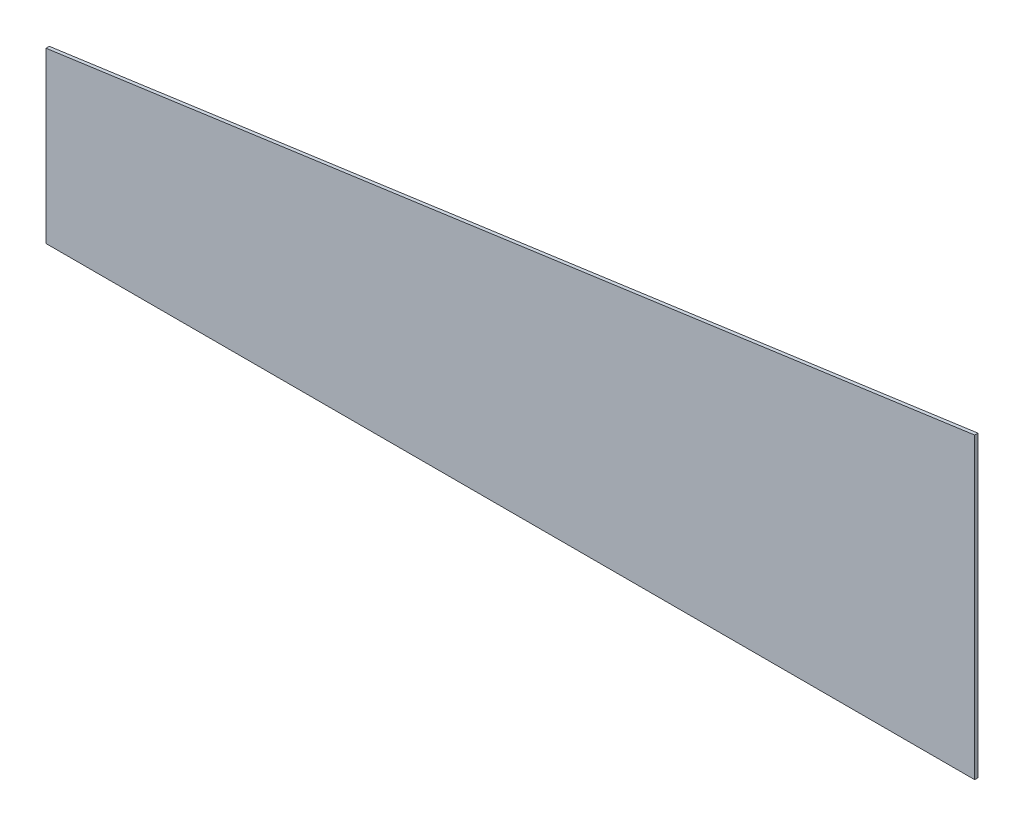
ISO-10303-21;
HEADER;
FILE_DESCRIPTION(('STEP AP214'),'2;1');
FILE_NAME('part.step','',(''),(''),'','','');
FILE_SCHEMA(('AUTOMOTIVE_DESIGN { 1 0 10303 214 1 1 1 1 }'));
ENDSEC;
DATA;
#1=APPLICATION_CONTEXT('core data for automotive mechanical design processes');
#2=APPLICATION_PROTOCOL_DEFINITION('international standard','automotive_design',2000,#1);
#3=PRODUCT_CONTEXT('',#1,'mechanical');
#4=PRODUCT('Part','Part','',(#3));
#5=PRODUCT_RELATED_PRODUCT_CATEGORY('part','',(#4));
#6=PRODUCT_DEFINITION_FORMATION('','',#4);
#7=PRODUCT_DEFINITION_CONTEXT('part definition',#1,'design');
#8=PRODUCT_DEFINITION('design','',#6,#7);
#9=PRODUCT_DEFINITION_SHAPE('','',#8);
#10=(LENGTH_UNIT() NAMED_UNIT(*) SI_UNIT(.MILLI.,.METRE.));
#11=(NAMED_UNIT(*) PLANE_ANGLE_UNIT() SI_UNIT($,.RADIAN.));
#12=(NAMED_UNIT(*) SI_UNIT($,.STERADIAN.) SOLID_ANGLE_UNIT());
#13=UNCERTAINTY_MEASURE_WITH_UNIT(LENGTH_MEASURE(1.E-05),#10,'distance_accuracy_value','');
#14=(GEOMETRIC_REPRESENTATION_CONTEXT(3) GLOBAL_UNCERTAINTY_ASSIGNED_CONTEXT((#13)) GLOBAL_UNIT_ASSIGNED_CONTEXT((#10,
#11,#12)) REPRESENTATION_CONTEXT('',''));
#15=CARTESIAN_POINT('',(0.,0.,0.));
#16=DIRECTION('',(0.,0.,1.));
#17=DIRECTION('',(1.,0.,0.));
#18=AXIS2_PLACEMENT_3D('',#15,#16,#17);
#19=CARTESIAN_POINT('',(-280.,0.,1.));
#20=DIRECTION('',(-1.,0.,0.));
#21=DIRECTION('',(0.,0.,1.));
#22=AXIS2_PLACEMENT_3D('',#19,#20,#21);
#23=PLANE('',#22);
#24=DIRECTION('',(0.,1.,0.));
#25=VECTOR('',#24,1.);
#26=CARTESIAN_POINT('',(-280.,0.,0.));
#27=LINE('',#26,#25);
#28=CARTESIAN_POINT('',(-280.,0.,0.));
#29=VERTEX_POINT('',#28);
#30=CARTESIAN_POINT('',(-280.,51.,0.));
#31=VERTEX_POINT('',#30);
#32=EDGE_CURVE('E97',#29,#31,#27,.T.);
#33=ORIENTED_EDGE('',*,*,#32,.F.);
#34=DIRECTION('',(0.,0.,-1.));
#35=VECTOR('',#34,1.);
#36=CARTESIAN_POINT('',(-280.,0.,1.));
#37=LINE('',#36,#35);
#38=CARTESIAN_POINT('',(-280.,0.,1.));
#39=VERTEX_POINT('',#38);
#40=EDGE_CURVE('E11',#39,#29,#37,.T.);
#41=ORIENTED_EDGE('',*,*,#40,.F.);
#42=DIRECTION('',(0.,1.,0.));
#43=VECTOR('',#42,1.);
#44=CARTESIAN_POINT('',(-280.,0.,1.));
#45=LINE('',#44,#43);
#46=CARTESIAN_POINT('',(-280.,51.,1.));
#47=VERTEX_POINT('',#46);
#48=EDGE_CURVE('E91',#39,#47,#45,.T.);
#49=ORIENTED_EDGE('',*,*,#48,.T.);
#50=DIRECTION('',(0.,0.,-1.));
#51=VECTOR('',#50,1.);
#52=CARTESIAN_POINT('',(-280.,51.,1.));
#53=LINE('',#52,#51);
#54=EDGE_CURVE('E36',#47,#31,#53,.T.);
#55=ORIENTED_EDGE('',*,*,#54,.T.);
#56=EDGE_LOOP('',(#33,#41,#49,#55));
#57=FACE_BOUND('',#56,.T.);
#58=ADVANCED_FACE('F33',(#57),#23,.T.);
#59=CARTESIAN_POINT('',(0.,0.,1.));
#60=DIRECTION('',(0.,-1.,0.));
#61=DIRECTION('',(1.,0.,0.));
#62=AXIS2_PLACEMENT_3D('',#59,#60,#61);
#63=PLANE('',#62);
#64=DIRECTION('',(-1.,0.,0.));
#65=VECTOR('',#64,1.);
#66=CARTESIAN_POINT('',(0.,0.,0.));
#67=LINE('',#66,#65);
#68=CARTESIAN_POINT('',(0.,0.,0.));
#69=VERTEX_POINT('',#68);
#70=EDGE_CURVE('E93',#69,#29,#67,.T.);
#71=ORIENTED_EDGE('',*,*,#70,.F.);
#72=DIRECTION('',(0.,0.,-1.));
#73=VECTOR('',#72,1.);
#74=CARTESIAN_POINT('',(0.,0.,1.));
#75=LINE('',#74,#73);
#76=CARTESIAN_POINT('',(0.,0.,1.));
#77=VERTEX_POINT('',#76);
#78=EDGE_CURVE('E42',#77,#69,#75,.T.);
#79=ORIENTED_EDGE('',*,*,#78,.F.);
#80=DIRECTION('',(-1.,0.,0.));
#81=VECTOR('',#80,1.);
#82=CARTESIAN_POINT('',(0.,0.,1.));
#83=LINE('',#82,#81);
#84=EDGE_CURVE('E88',#77,#39,#83,.T.);
#85=ORIENTED_EDGE('',*,*,#84,.T.);
#86=ORIENTED_EDGE('',*,*,#40,.T.);
#87=EDGE_LOOP('',(#71,#79,#85,#86));
#88=FACE_BOUND('',#87,.T.);
#89=ADVANCED_FACE('F107',(#88),#63,.T.);
#90=CARTESIAN_POINT('',(0.,90.,1.));
#91=DIRECTION('',(1.,0.,0.));
#92=DIRECTION('',(0.,1.,0.));
#93=AXIS2_PLACEMENT_3D('',#90,#91,#92);
#94=PLANE('',#93);
#95=DIRECTION('',(0.,-1.,0.));
#96=VECTOR('',#95,1.);
#97=CARTESIAN_POINT('',(0.,90.,0.));
#98=LINE('',#97,#96);
#99=CARTESIAN_POINT('',(0.,90.,0.));
#100=VERTEX_POINT('',#99);
#101=EDGE_CURVE('E83',#100,#69,#98,.T.);
#102=ORIENTED_EDGE('',*,*,#101,.F.);
#103=DIRECTION('',(0.,0.,-1.));
#104=VECTOR('',#103,1.);
#105=CARTESIAN_POINT('',(0.,90.,1.));
#106=LINE('',#105,#104);
#107=CARTESIAN_POINT('',(0.,90.,1.));
#108=VERTEX_POINT('',#107);
#109=EDGE_CURVE('E78',#108,#100,#106,.T.);
#110=ORIENTED_EDGE('',*,*,#109,.F.);
#111=DIRECTION('',(0.,-1.,0.));
#112=VECTOR('',#111,1.);
#113=CARTESIAN_POINT('',(0.,90.,1.));
#114=LINE('',#113,#112);
#115=EDGE_CURVE('E81',#108,#77,#114,.T.);
#116=ORIENTED_EDGE('',*,*,#115,.T.);
#117=ORIENTED_EDGE('',*,*,#78,.T.);
#118=EDGE_LOOP('',(#102,#110,#116,#117));
#119=FACE_BOUND('',#118,.T.);
#120=ADVANCED_FACE('F80',(#119),#94,.T.);
#121=CARTESIAN_POINT('',(-280.,51.,1.));
#122=DIRECTION('',(-0.137953953920265,0.990438643530111,0.));
#123=DIRECTION('',(-0.99043864353011,-0.137953953920265,0.));
#124=AXIS2_PLACEMENT_3D('',#121,#122,#123);
#125=PLANE('',#124);
#126=DIRECTION('',(0.99043864353011,0.137953953920265,0.));
#127=VECTOR('',#126,1.);
#128=CARTESIAN_POINT('',(-280.,51.,0.));
#129=LINE('',#128,#127);
#130=EDGE_CURVE('E100',#31,#100,#129,.T.);
#131=ORIENTED_EDGE('',*,*,#130,.F.);
#132=ORIENTED_EDGE('',*,*,#54,.F.);
#133=DIRECTION('',(0.99043864353011,0.137953953920265,0.));
#134=VECTOR('',#133,1.);
#135=CARTESIAN_POINT('',(-280.,51.,1.));
#136=LINE('',#135,#134);
#137=EDGE_CURVE('E87',#47,#108,#136,.T.);
#138=ORIENTED_EDGE('',*,*,#137,.T.);
#139=ORIENTED_EDGE('',*,*,#109,.T.);
#140=EDGE_LOOP('',(#131,#132,#138,#139));
#141=FACE_BOUND('',#140,.T.);
#142=ADVANCED_FACE('F90',(#141),#125,.T.);
#143=CARTESIAN_POINT('',(0.,0.,1.));
#144=DIRECTION('',(0.,0.,1.));
#145=DIRECTION('',(1.,0.,0.));
#146=AXIS2_PLACEMENT_3D('',#143,#144,#145);
#147=PLANE('',#146);
#148=ORIENTED_EDGE('',*,*,#48,.F.);
#149=ORIENTED_EDGE('',*,*,#84,.F.);
#150=ORIENTED_EDGE('',*,*,#115,.F.);
#151=ORIENTED_EDGE('',*,*,#137,.F.);
#152=EDGE_LOOP('',(#148,#149,#150,#151));
#153=FACE_BOUND('',#152,.T.);
#154=ADVANCED_FACE('F86',(#153),#147,.T.);
#155=CARTESIAN_POINT('',(0.,0.,0.));
#156=DIRECTION('',(0.,0.,1.));
#157=DIRECTION('',(1.,0.,0.));
#158=AXIS2_PLACEMENT_3D('',#155,#156,#157);
#159=PLANE('',#158);
#160=ORIENTED_EDGE('',*,*,#32,.T.);
#161=ORIENTED_EDGE('',*,*,#130,.T.);
#162=ORIENTED_EDGE('',*,*,#101,.T.);
#163=ORIENTED_EDGE('',*,*,#70,.T.);
#164=EDGE_LOOP('',(#160,#161,#162,#163));
#165=FACE_BOUND('',#164,.T.);
#166=ADVANCED_FACE('F106',(#165),#159,.F.);
#167=CLOSED_SHELL('',(#58,#89,#120,#142,#154,#166));
#168=MANIFOLD_SOLID_BREP('B2',#167);
#169=ADVANCED_BREP_SHAPE_REPRESENTATION('',(#18,#168),#14);
#170=SHAPE_DEFINITION_REPRESENTATION(#9,#169);
ENDSEC;
END-ISO-10303-21;
